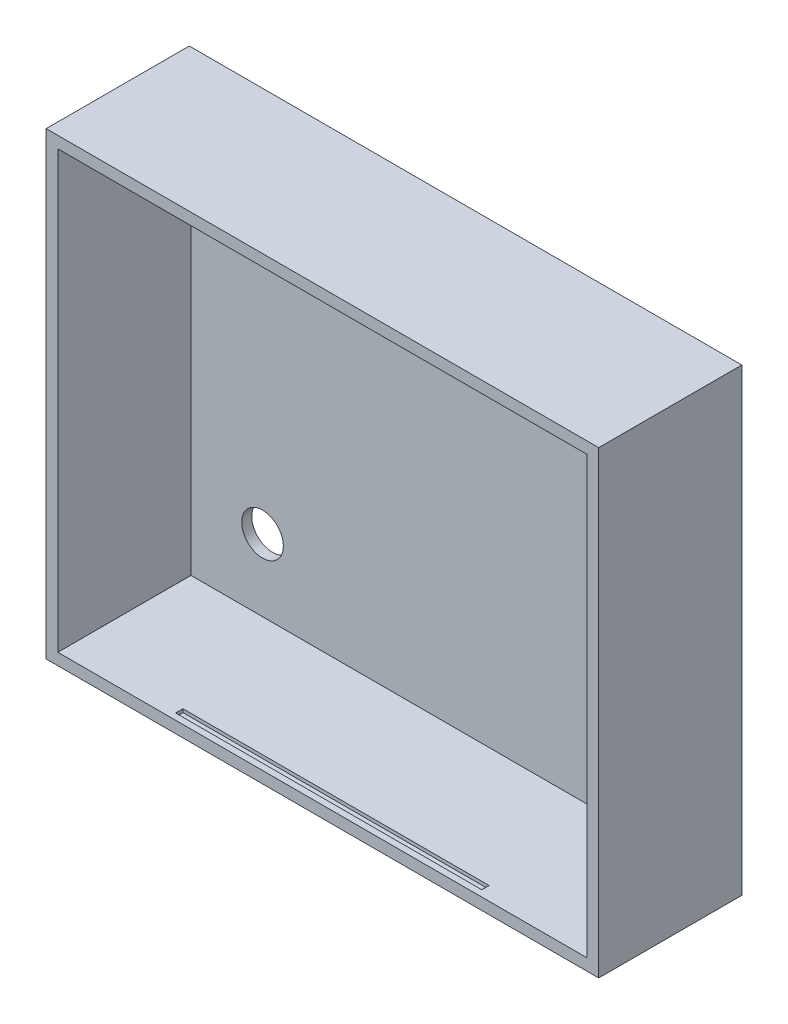
ISO-10303-21;
HEADER;
FILE_DESCRIPTION(('STEP AP214'),'2;1');
FILE_NAME('part.step','',(''),(''),'','','');
FILE_SCHEMA(('AUTOMOTIVE_DESIGN { 1 0 10303 214 1 1 1 1 }'));
ENDSEC;
DATA;
#1=APPLICATION_CONTEXT('core data for automotive mechanical design processes');
#2=APPLICATION_PROTOCOL_DEFINITION('international standard','automotive_design',2000,#1);
#3=PRODUCT_CONTEXT('',#1,'mechanical');
#4=PRODUCT('Part','Part','',(#3));
#5=PRODUCT_RELATED_PRODUCT_CATEGORY('part','',(#4));
#6=PRODUCT_DEFINITION_FORMATION('','',#4);
#7=PRODUCT_DEFINITION_CONTEXT('part definition',#1,'design');
#8=PRODUCT_DEFINITION('design','',#6,#7);
#9=PRODUCT_DEFINITION_SHAPE('','',#8);
#10=(LENGTH_UNIT() NAMED_UNIT(*) SI_UNIT(.MILLI.,.METRE.));
#11=(NAMED_UNIT(*) PLANE_ANGLE_UNIT() SI_UNIT($,.RADIAN.));
#12=(NAMED_UNIT(*) SI_UNIT($,.STERADIAN.) SOLID_ANGLE_UNIT());
#13=UNCERTAINTY_MEASURE_WITH_UNIT(LENGTH_MEASURE(1.E-05),#10,'distance_accuracy_value','');
#14=(GEOMETRIC_REPRESENTATION_CONTEXT(3) GLOBAL_UNCERTAINTY_ASSIGNED_CONTEXT((#13)) GLOBAL_UNIT_ASSIGNED_CONTEXT((#10,
#11,#12)) REPRESENTATION_CONTEXT('',''));
#15=CARTESIAN_POINT('',(0.,0.,0.));
#16=DIRECTION('',(0.,0.,1.));
#17=DIRECTION('',(1.,0.,0.));
#18=AXIS2_PLACEMENT_3D('',#15,#16,#17);
#19=CARTESIAN_POINT('',(83.,-69.,3.));
#20=DIRECTION('',(-1.,0.,0.));
#21=DIRECTION('',(0.,0.,1.));
#22=AXIS2_PLACEMENT_3D('',#19,#20,#21);
#23=PLANE('',#22);
#24=DIRECTION('',(0.,1.,0.));
#25=VECTOR('',#24,1.);
#26=CARTESIAN_POINT('',(83.,-69.,0.));
#27=LINE('',#26,#25);
#28=CARTESIAN_POINT('',(83.,-69.,0.));
#29=VERTEX_POINT('',#28);
#30=CARTESIAN_POINT('',(83.,69.,0.));
#31=VERTEX_POINT('',#30);
#32=EDGE_CURVE('E338',#29,#31,#27,.T.);
#33=ORIENTED_EDGE('',*,*,#32,.T.);
#34=DIRECTION('',(0.,0.,-1.));
#35=VECTOR('',#34,1.);
#36=CARTESIAN_POINT('',(83.,69.,3.));
#37=LINE('',#36,#35);
#38=CARTESIAN_POINT('',(83.,69.,43.));
#39=VERTEX_POINT('',#38);
#40=EDGE_CURVE('E11',#39,#31,#37,.T.);
#41=ORIENTED_EDGE('',*,*,#40,.F.);
#42=DIRECTION('',(0.,1.,0.));
#43=VECTOR('',#42,1.);
#44=CARTESIAN_POINT('',(83.,0.,43.));
#45=LINE('',#44,#43);
#46=CARTESIAN_POINT('',(83.,-69.,43.));
#47=VERTEX_POINT('',#46);
#48=EDGE_CURVE('E298',#47,#39,#45,.T.);
#49=ORIENTED_EDGE('',*,*,#48,.F.);
#50=DIRECTION('',(0.,0.,-1.));
#51=VECTOR('',#50,1.);
#52=CARTESIAN_POINT('',(83.,-69.,3.));
#53=LINE('',#52,#51);
#54=EDGE_CURVE('E351',#47,#29,#53,.T.);
#55=ORIENTED_EDGE('',*,*,#54,.T.);
#56=EDGE_LOOP('',(#33,#41,#49,#55));
#57=FACE_BOUND('',#56,.T.);
#58=ADVANCED_FACE('F41',(#57),#23,.F.);
#59=CARTESIAN_POINT('',(-83.,69.,3.));
#60=DIRECTION('',(0.,-1.,0.));
#61=DIRECTION('',(0.,0.,-1.));
#62=AXIS2_PLACEMENT_3D('',#59,#60,#61);
#63=PLANE('',#62);
#64=DIRECTION('',(-1.,0.,0.));
#65=VECTOR('',#64,1.);
#66=CARTESIAN_POINT('',(-83.,69.,0.));
#67=LINE('',#66,#65);
#68=CARTESIAN_POINT('',(-83.,69.,0.));
#69=VERTEX_POINT('',#68);
#70=EDGE_CURVE('E342',#31,#69,#67,.T.);
#71=ORIENTED_EDGE('',*,*,#70,.T.);
#72=DIRECTION('',(0.,0.,-1.));
#73=VECTOR('',#72,1.);
#74=CARTESIAN_POINT('',(-83.,69.,3.));
#75=LINE('',#74,#73);
#76=CARTESIAN_POINT('',(-83.,69.,43.));
#77=VERTEX_POINT('',#76);
#78=EDGE_CURVE('E49',#77,#69,#75,.T.);
#79=ORIENTED_EDGE('',*,*,#78,.F.);
#80=DIRECTION('',(-1.,0.,0.));
#81=VECTOR('',#80,1.);
#82=CARTESIAN_POINT('',(0.,69.,43.));
#83=LINE('',#82,#81);
#84=EDGE_CURVE('E302',#39,#77,#83,.T.);
#85=ORIENTED_EDGE('',*,*,#84,.F.);
#86=ORIENTED_EDGE('',*,*,#40,.T.);
#87=EDGE_LOOP('',(#71,#79,#85,#86));
#88=FACE_BOUND('',#87,.T.);
#89=ADVANCED_FACE('F377',(#88),#63,.F.);
#90=CARTESIAN_POINT('',(-83.,-69.,3.));
#91=DIRECTION('',(1.,0.,0.));
#92=DIRECTION('',(0.,0.,-1.));
#93=AXIS2_PLACEMENT_3D('',#90,#91,#92);
#94=PLANE('',#93);
#95=DIRECTION('',(0.,-1.,0.));
#96=VECTOR('',#95,1.);
#97=CARTESIAN_POINT('',(-83.,-69.,0.));
#98=LINE('',#97,#96);
#99=CARTESIAN_POINT('',(-83.,-69.,0.));
#100=VERTEX_POINT('',#99);
#101=EDGE_CURVE('E345',#69,#100,#98,.T.);
#102=ORIENTED_EDGE('',*,*,#101,.T.);
#103=DIRECTION('',(0.,0.,-1.));
#104=VECTOR('',#103,1.);
#105=CARTESIAN_POINT('',(-83.,-69.,3.));
#106=LINE('',#105,#104);
#107=CARTESIAN_POINT('',(-83.,-69.,43.));
#108=VERTEX_POINT('',#107);
#109=EDGE_CURVE('E355',#108,#100,#106,.T.);
#110=ORIENTED_EDGE('',*,*,#109,.F.);
#111=DIRECTION('',(0.,-1.,0.));
#112=VECTOR('',#111,1.);
#113=CARTESIAN_POINT('',(-83.,0.,43.));
#114=LINE('',#113,#112);
#115=EDGE_CURVE('E306',#77,#108,#114,.T.);
#116=ORIENTED_EDGE('',*,*,#115,.F.);
#117=ORIENTED_EDGE('',*,*,#78,.T.);
#118=EDGE_LOOP('',(#102,#110,#116,#117));
#119=FACE_BOUND('',#118,.T.);
#120=ADVANCED_FACE('F363',(#119),#94,.F.);
#121=CARTESIAN_POINT('',(-83.,-69.,3.));
#122=DIRECTION('',(0.,1.,0.));
#123=DIRECTION('',(0.,0.,1.));
#124=AXIS2_PLACEMENT_3D('',#121,#122,#123);
#125=PLANE('',#124);
#126=DIRECTION('',(1.,0.,0.));
#127=VECTOR('',#126,1.);
#128=CARTESIAN_POINT('',(-83.,-69.,0.));
#129=LINE('',#128,#127);
#130=EDGE_CURVE('E348',#100,#29,#129,.T.);
#131=ORIENTED_EDGE('',*,*,#130,.T.);
#132=ORIENTED_EDGE('',*,*,#54,.F.);
#133=DIRECTION('',(1.,0.,0.));
#134=VECTOR('',#133,1.);
#135=CARTESIAN_POINT('',(0.,-69.,43.));
#136=LINE('',#135,#134);
#137=EDGE_CURVE('E294',#108,#47,#136,.T.);
#138=ORIENTED_EDGE('',*,*,#137,.F.);
#139=ORIENTED_EDGE('',*,*,#109,.T.);
#140=EDGE_LOOP('',(#131,#132,#138,#139));
#141=FACE_BOUND('',#140,.T.);
#142=ADVANCED_FACE('F371',(#141),#125,.F.);
#143=CARTESIAN_POINT('',(0.,0.,0.));
#144=DIRECTION('',(0.,0.,-1.));
#145=DIRECTION('',(-1.,0.,0.));
#146=AXIS2_PLACEMENT_3D('',#143,#144,#145);
#147=PLANE('',#146);
#148=CARTESIAN_POINT('',(58.,44.,0.));
#149=DIRECTION('',(0.,0.,-1.));
#150=DIRECTION('',(-1.,0.,0.));
#151=AXIS2_PLACEMENT_3D('',#148,#149,#150);
#152=CIRCLE('',#151,6.25);
#153=CARTESIAN_POINT('',(64.25,44.,0.));
#154=VERTEX_POINT('',#153);
#155=EDGE_CURVE('E238',#154,#154,#152,.F.);
#156=ORIENTED_EDGE('',*,*,#155,.T.);
#157=EDGE_LOOP('',(#156));
#158=FACE_BOUND('',#157,.T.);
#159=CARTESIAN_POINT('',(58.,-44.,0.));
#160=DIRECTION('',(0.,0.,-1.));
#161=DIRECTION('',(-1.,0.,0.));
#162=AXIS2_PLACEMENT_3D('',#159,#160,#161);
#163=CIRCLE('',#162,6.25);
#164=CARTESIAN_POINT('',(64.25,-44.,0.));
#165=VERTEX_POINT('',#164);
#166=EDGE_CURVE('E260',#165,#165,#163,.F.);
#167=ORIENTED_EDGE('',*,*,#166,.T.);
#168=EDGE_LOOP('',(#167));
#169=FACE_BOUND('',#168,.T.);
#170=CARTESIAN_POINT('',(-58.,-44.,0.));
#171=DIRECTION('',(0.,0.,-1.));
#172=DIRECTION('',(-1.,0.,0.));
#173=AXIS2_PLACEMENT_3D('',#170,#171,#172);
#174=CIRCLE('',#173,6.25);
#175=CARTESIAN_POINT('',(-51.75,-44.,0.));
#176=VERTEX_POINT('',#175);
#177=EDGE_CURVE('E252',#176,#176,#174,.F.);
#178=ORIENTED_EDGE('',*,*,#177,.T.);
#179=EDGE_LOOP('',(#178));
#180=FACE_BOUND('',#179,.T.);
#181=CARTESIAN_POINT('',(-58.,44.,0.));
#182=DIRECTION('',(0.,0.,-1.));
#183=DIRECTION('',(-1.,0.,0.));
#184=AXIS2_PLACEMENT_3D('',#181,#182,#183);
#185=CIRCLE('',#184,6.25);
#186=CARTESIAN_POINT('',(-51.75,44.,0.));
#187=VERTEX_POINT('',#186);
#188=EDGE_CURVE('E251',#187,#187,#185,.F.);
#189=ORIENTED_EDGE('',*,*,#188,.T.);
#190=EDGE_LOOP('',(#189));
#191=FACE_BOUND('',#190,.T.);
#192=ORIENTED_EDGE('',*,*,#32,.F.);
#193=ORIENTED_EDGE('',*,*,#130,.F.);
#194=ORIENTED_EDGE('',*,*,#101,.F.);
#195=ORIENTED_EDGE('',*,*,#70,.F.);
#196=EDGE_LOOP('',(#192,#193,#194,#195));
#197=FACE_BOUND('',#196,.T.);
#198=ADVANCED_FACE('F369',(#158,#169,#180,#191,#197),#147,.T.);
#199=CARTESIAN_POINT('',(79.5,0.,43.));
#200=DIRECTION('',(-1.,0.,0.));
#201=DIRECTION('',(0.,0.,1.));
#202=AXIS2_PLACEMENT_3D('',#199,#200,#201);
#203=PLANE('',#202);
#204=DIRECTION('',(0.,1.,0.));
#205=VECTOR('',#204,1.);
#206=CARTESIAN_POINT('',(79.5,0.,3.));
#207=LINE('',#206,#205);
#208=CARTESIAN_POINT('',(79.5,-65.5,3.));
#209=VERTEX_POINT('',#208);
#210=CARTESIAN_POINT('',(79.5,65.5,3.));
#211=VERTEX_POINT('',#210);
#212=EDGE_CURVE('E275',#209,#211,#207,.T.);
#213=ORIENTED_EDGE('',*,*,#212,.F.);
#214=DIRECTION('',(0.,0.,-1.));
#215=VECTOR('',#214,1.);
#216=CARTESIAN_POINT('',(79.5,-65.5,43.));
#217=LINE('',#216,#215);
#218=CARTESIAN_POINT('',(79.5,-65.5,43.));
#219=VERTEX_POINT('',#218);
#220=EDGE_CURVE('E334',#219,#209,#217,.T.);
#221=ORIENTED_EDGE('',*,*,#220,.F.);
#222=DIRECTION('',(0.,1.,0.));
#223=VECTOR('',#222,1.);
#224=CARTESIAN_POINT('',(79.5,0.,43.));
#225=LINE('',#224,#223);
#226=CARTESIAN_POINT('',(79.5,65.5,43.));
#227=VERTEX_POINT('',#226);
#228=EDGE_CURVE('E279',#219,#227,#225,.T.);
#229=ORIENTED_EDGE('',*,*,#228,.T.);
#230=DIRECTION('',(0.,0.,-1.));
#231=VECTOR('',#230,1.);
#232=CARTESIAN_POINT('',(79.5,65.5,43.));
#233=LINE('',#232,#231);
#234=EDGE_CURVE('E310',#227,#211,#233,.T.);
#235=ORIENTED_EDGE('',*,*,#234,.T.);
#236=EDGE_LOOP('',(#213,#221,#229,#235));
#237=FACE_BOUND('',#236,.T.);
#238=ADVANCED_FACE('F389',(#237),#203,.T.);
#239=CARTESIAN_POINT('',(0.,-65.5,43.));
#240=DIRECTION('',(0.,1.,0.));
#241=DIRECTION('',(0.,0.,1.));
#242=AXIS2_PLACEMENT_3D('',#239,#240,#241);
#243=PLANE('',#242);
#244=DIRECTION('',(0.,0.,-1.));
#245=VECTOR('',#244,1.);
#246=CARTESIAN_POINT('',(45.98504456449,-65.5,38.9));
#247=LINE('',#246,#245);
#248=CARTESIAN_POINT('',(45.98504456449,-65.5,41.1));
#249=VERTEX_POINT('',#248);
#250=CARTESIAN_POINT('',(45.98504456449,-65.5,38.9));
#251=VERTEX_POINT('',#250);
#252=EDGE_CURVE('E56',#249,#251,#247,.T.);
#253=ORIENTED_EDGE('',*,*,#252,.F.);
#254=DIRECTION('',(1.,0.,0.));
#255=VECTOR('',#254,1.);
#256=CARTESIAN_POINT('',(-46.01495543551,-65.5,41.1));
#257=LINE('',#256,#255);
#258=CARTESIAN_POINT('',(-46.01495543551,-65.5,41.1));
#259=VERTEX_POINT('',#258);
#260=EDGE_CURVE('E177',#259,#249,#257,.T.);
#261=ORIENTED_EDGE('',*,*,#260,.F.);
#262=DIRECTION('',(0.,0.,1.));
#263=VECTOR('',#262,1.);
#264=CARTESIAN_POINT('',(-46.01495543551,-65.5,38.9));
#265=LINE('',#264,#263);
#266=CARTESIAN_POINT('',(-46.01495543551,-65.5,38.9));
#267=VERTEX_POINT('',#266);
#268=EDGE_CURVE('E181',#267,#259,#265,.T.);
#269=ORIENTED_EDGE('',*,*,#268,.F.);
#270=DIRECTION('',(-1.,0.,0.));
#271=VECTOR('',#270,1.);
#272=CARTESIAN_POINT('',(-46.01495543551,-65.5,38.9));
#273=LINE('',#272,#271);
#274=EDGE_CURVE('E190',#251,#267,#273,.T.);
#275=ORIENTED_EDGE('',*,*,#274,.F.);
#276=EDGE_LOOP('',(#253,#261,#269,#275));
#277=FACE_BOUND('',#276,.T.);
#278=DIRECTION('',(1.,0.,0.));
#279=VECTOR('',#278,1.);
#280=CARTESIAN_POINT('',(0.,-65.5,3.));
#281=LINE('',#280,#279);
#282=CARTESIAN_POINT('',(-79.5,-65.5,3.));
#283=VERTEX_POINT('',#282);
#284=EDGE_CURVE('E313',#283,#209,#281,.T.);
#285=ORIENTED_EDGE('',*,*,#284,.F.);
#286=DIRECTION('',(0.,0.,-1.));
#287=VECTOR('',#286,1.);
#288=CARTESIAN_POINT('',(-79.5,-65.5,43.));
#289=LINE('',#288,#287);
#290=CARTESIAN_POINT('',(-79.5,-65.5,43.));
#291=VERTEX_POINT('',#290);
#292=EDGE_CURVE('E330',#291,#283,#289,.T.);
#293=ORIENTED_EDGE('',*,*,#292,.F.);
#294=DIRECTION('',(1.,0.,0.));
#295=VECTOR('',#294,1.);
#296=CARTESIAN_POINT('',(0.,-65.5,43.));
#297=LINE('',#296,#295);
#298=EDGE_CURVE('E283',#291,#219,#297,.T.);
#299=ORIENTED_EDGE('',*,*,#298,.T.);
#300=ORIENTED_EDGE('',*,*,#220,.T.);
#301=EDGE_LOOP('',(#285,#293,#299,#300));
#302=FACE_BOUND('',#301,.T.);
#303=ADVANCED_FACE('F398',(#277,#302),#243,.T.);
#304=CARTESIAN_POINT('',(-79.5,0.,43.));
#305=DIRECTION('',(-1.,0.,0.));
#306=DIRECTION('',(0.,0.,1.));
#307=AXIS2_PLACEMENT_3D('',#304,#305,#306);
#308=PLANE('',#307);
#309=DIRECTION('',(0.,1.,0.));
#310=VECTOR('',#309,1.);
#311=CARTESIAN_POINT('',(-79.5,0.,3.));
#312=LINE('',#311,#310);
#313=CARTESIAN_POINT('',(-79.5,65.5,3.));
#314=VERTEX_POINT('',#313);
#315=EDGE_CURVE('E316',#283,#314,#312,.T.);
#316=ORIENTED_EDGE('',*,*,#315,.T.);
#317=DIRECTION('',(0.,0.,-1.));
#318=VECTOR('',#317,1.);
#319=CARTESIAN_POINT('',(-79.5,65.5,43.));
#320=LINE('',#319,#318);
#321=CARTESIAN_POINT('',(-79.5,65.5,43.));
#322=VERTEX_POINT('',#321);
#323=EDGE_CURVE('E326',#322,#314,#320,.T.);
#324=ORIENTED_EDGE('',*,*,#323,.F.);
#325=DIRECTION('',(0.,1.,0.));
#326=VECTOR('',#325,1.);
#327=CARTESIAN_POINT('',(-79.5,0.,43.));
#328=LINE('',#327,#326);
#329=EDGE_CURVE('E288',#291,#322,#328,.T.);
#330=ORIENTED_EDGE('',*,*,#329,.F.);
#331=ORIENTED_EDGE('',*,*,#292,.T.);
#332=EDGE_LOOP('',(#316,#324,#330,#331));
#333=FACE_BOUND('',#332,.T.);
#334=ADVANCED_FACE('F402',(#333),#308,.F.);
#335=CARTESIAN_POINT('',(0.,65.5,43.));
#336=DIRECTION('',(0.,1.,0.));
#337=DIRECTION('',(0.,0.,1.));
#338=AXIS2_PLACEMENT_3D('',#335,#336,#337);
#339=PLANE('',#338);
#340=DIRECTION('',(-1.,0.,0.));
#341=VECTOR('',#340,1.);
#342=CARTESIAN_POINT('',(-46.,65.5,41.1));
#343=LINE('',#342,#341);
#344=CARTESIAN_POINT('',(46.,65.5,41.1));
#345=VERTEX_POINT('',#344);
#346=CARTESIAN_POINT('',(-46.,65.5,41.1));
#347=VERTEX_POINT('',#346);
#348=EDGE_CURVE('E224',#345,#347,#343,.T.);
#349=ORIENTED_EDGE('',*,*,#348,.F.);
#350=DIRECTION('',(0.,0.,1.));
#351=VECTOR('',#350,1.);
#352=CARTESIAN_POINT('',(46.,65.5,41.1));
#353=LINE('',#352,#351);
#354=CARTESIAN_POINT('',(46.,65.5,38.9));
#355=VERTEX_POINT('',#354);
#356=EDGE_CURVE('E64',#355,#345,#353,.T.);
#357=ORIENTED_EDGE('',*,*,#356,.F.);
#358=DIRECTION('',(1.,0.,0.));
#359=VECTOR('',#358,1.);
#360=CARTESIAN_POINT('',(-46.,65.5,38.9));
#361=LINE('',#360,#359);
#362=CARTESIAN_POINT('',(-46.,65.5,38.9));
#363=VERTEX_POINT('',#362);
#364=EDGE_CURVE('E209',#363,#355,#361,.T.);
#365=ORIENTED_EDGE('',*,*,#364,.F.);
#366=DIRECTION('',(0.,0.,-1.));
#367=VECTOR('',#366,1.);
#368=CARTESIAN_POINT('',(-46.,65.5,41.1));
#369=LINE('',#368,#367);
#370=EDGE_CURVE('E228',#347,#363,#369,.T.);
#371=ORIENTED_EDGE('',*,*,#370,.F.);
#372=EDGE_LOOP('',(#349,#357,#365,#371));
#373=FACE_BOUND('',#372,.T.);
#374=DIRECTION('',(1.,0.,0.));
#375=VECTOR('',#374,1.);
#376=CARTESIAN_POINT('',(0.,65.5,3.));
#377=LINE('',#376,#375);
#378=EDGE_CURVE('E284',#314,#211,#377,.T.);
#379=ORIENTED_EDGE('',*,*,#378,.T.);
#380=ORIENTED_EDGE('',*,*,#234,.F.);
#381=DIRECTION('',(1.,0.,0.));
#382=VECTOR('',#381,1.);
#383=CARTESIAN_POINT('',(0.,65.5,43.));
#384=LINE('',#383,#382);
#385=EDGE_CURVE('E291',#322,#227,#384,.T.);
#386=ORIENTED_EDGE('',*,*,#385,.F.);
#387=ORIENTED_EDGE('',*,*,#323,.T.);
#388=EDGE_LOOP('',(#379,#380,#386,#387));
#389=FACE_BOUND('',#388,.T.);
#390=ADVANCED_FACE('F406',(#373,#389),#339,.F.);
#391=CARTESIAN_POINT('',(0.,0.,43.));
#392=DIRECTION('',(0.,0.,1.));
#393=DIRECTION('',(1.,0.,0.));
#394=AXIS2_PLACEMENT_3D('',#391,#392,#393);
#395=PLANE('',#394);
#396=ORIENTED_EDGE('',*,*,#228,.F.);
#397=ORIENTED_EDGE('',*,*,#298,.F.);
#398=ORIENTED_EDGE('',*,*,#329,.T.);
#399=ORIENTED_EDGE('',*,*,#385,.T.);
#400=EDGE_LOOP('',(#396,#397,#398,#399));
#401=FACE_BOUND('',#400,.T.);
#402=ORIENTED_EDGE('',*,*,#137,.T.);
#403=ORIENTED_EDGE('',*,*,#48,.T.);
#404=ORIENTED_EDGE('',*,*,#84,.T.);
#405=ORIENTED_EDGE('',*,*,#115,.T.);
#406=EDGE_LOOP('',(#402,#403,#404,#405));
#407=FACE_BOUND('',#406,.T.);
#408=ADVANCED_FACE('F376',(#401,#407),#395,.T.);
#409=CARTESIAN_POINT('',(0.,0.,3.));
#410=DIRECTION('',(0.,0.,-1.));
#411=DIRECTION('',(-1.,0.,0.));
#412=AXIS2_PLACEMENT_3D('',#409,#410,#411);
#413=PLANE('',#412);
#414=CARTESIAN_POINT('',(58.,44.,3.));
#415=DIRECTION('',(0.,0.,1.));
#416=DIRECTION('',(-1.,0.,0.));
#417=AXIS2_PLACEMENT_3D('',#414,#415,#416);
#418=CIRCLE('',#417,6.25);
#419=CARTESIAN_POINT('',(64.25,44.,3.));
#420=VERTEX_POINT('',#419);
#421=EDGE_CURVE('E264',#420,#420,#418,.T.);
#422=ORIENTED_EDGE('',*,*,#421,.F.);
#423=EDGE_LOOP('',(#422));
#424=FACE_BOUND('',#423,.T.);
#425=CARTESIAN_POINT('',(58.,-44.,3.));
#426=DIRECTION('',(0.,0.,1.));
#427=DIRECTION('',(1.,0.,0.));
#428=AXIS2_PLACEMENT_3D('',#425,#426,#427);
#429=CIRCLE('',#428,6.25);
#430=CARTESIAN_POINT('',(64.25,-44.,3.));
#431=VERTEX_POINT('',#430);
#432=EDGE_CURVE('E256',#431,#431,#429,.T.);
#433=ORIENTED_EDGE('',*,*,#432,.F.);
#434=EDGE_LOOP('',(#433));
#435=FACE_BOUND('',#434,.T.);
#436=CARTESIAN_POINT('',(-58.,-44.,3.));
#437=DIRECTION('',(0.,0.,1.));
#438=DIRECTION('',(-1.,0.,0.));
#439=AXIS2_PLACEMENT_3D('',#436,#437,#438);
#440=CIRCLE('',#439,6.25);
#441=CARTESIAN_POINT('',(-51.75,-44.,3.));
#442=VERTEX_POINT('',#441);
#443=EDGE_CURVE('E247',#442,#442,#440,.T.);
#444=ORIENTED_EDGE('',*,*,#443,.F.);
#445=EDGE_LOOP('',(#444));
#446=FACE_BOUND('',#445,.T.);
#447=CARTESIAN_POINT('',(-58.,44.,3.));
#448=DIRECTION('',(0.,0.,1.));
#449=DIRECTION('',(1.,0.,0.));
#450=AXIS2_PLACEMENT_3D('',#447,#448,#449);
#451=CIRCLE('',#450,6.25);
#452=CARTESIAN_POINT('',(-51.75,44.,3.));
#453=VERTEX_POINT('',#452);
#454=EDGE_CURVE('E271',#453,#453,#451,.T.);
#455=ORIENTED_EDGE('',*,*,#454,.F.);
#456=EDGE_LOOP('',(#455));
#457=FACE_BOUND('',#456,.T.);
#458=ORIENTED_EDGE('',*,*,#284,.T.);
#459=ORIENTED_EDGE('',*,*,#212,.T.);
#460=ORIENTED_EDGE('',*,*,#378,.F.);
#461=ORIENTED_EDGE('',*,*,#315,.F.);
#462=EDGE_LOOP('',(#458,#459,#460,#461));
#463=FACE_BOUND('',#462,.T.);
#464=ADVANCED_FACE('F391',(#424,#435,#446,#457,#463),#413,.F.);
#465=CARTESIAN_POINT('',(-58.,44.,-0.00100000000000013));
#466=DIRECTION('',(0.,0.,1.));
#467=DIRECTION('',(1.,0.,0.));
#468=AXIS2_PLACEMENT_3D('',#465,#466,#467);
#469=CYLINDRICAL_SURFACE('',#468,6.25);
#470=CARTESIAN_POINT('',(-51.75,44.,0.));
#471=CARTESIAN_POINT('',(-51.75,44.,0.03125));
#472=CARTESIAN_POINT('',(-51.75,44.,0.0625));
#473=CARTESIAN_POINT('',(-51.75,44.,0.125));
#474=CARTESIAN_POINT('',(-51.75,44.,0.15625));
#475=CARTESIAN_POINT('',(-51.75,44.,0.21875));
#476=CARTESIAN_POINT('',(-51.75,44.,0.25));
#477=CARTESIAN_POINT('',(-51.75,44.,0.3125));
#478=CARTESIAN_POINT('',(-51.75,44.,0.34375));
#479=CARTESIAN_POINT('',(-51.75,44.,0.40625));
#480=CARTESIAN_POINT('',(-51.75,44.,0.4375));
#481=CARTESIAN_POINT('',(-51.75,44.,0.5));
#482=CARTESIAN_POINT('',(-51.75,44.,0.53125));
#483=CARTESIAN_POINT('',(-51.75,44.,0.59375));
#484=CARTESIAN_POINT('',(-51.75,44.,0.625));
#485=CARTESIAN_POINT('',(-51.75,44.,0.6875));
#486=CARTESIAN_POINT('',(-51.75,44.,0.71875));
#487=CARTESIAN_POINT('',(-51.75,44.,0.78125));
#488=CARTESIAN_POINT('',(-51.75,44.,0.8125));
#489=CARTESIAN_POINT('',(-51.75,44.,0.875));
#490=CARTESIAN_POINT('',(-51.75,44.,0.90625));
#491=CARTESIAN_POINT('',(-51.75,44.,0.96875));
#492=CARTESIAN_POINT('',(-51.75,44.,1.));
#493=CARTESIAN_POINT('',(-51.75,44.,1.0625));
#494=CARTESIAN_POINT('',(-51.75,44.,1.09375));
#495=CARTESIAN_POINT('',(-51.75,44.,1.15625));
#496=CARTESIAN_POINT('',(-51.75,44.,1.1875));
#497=CARTESIAN_POINT('',(-51.75,44.,1.25));
#498=CARTESIAN_POINT('',(-51.75,44.,1.28125));
#499=CARTESIAN_POINT('',(-51.75,44.,1.34375));
#500=CARTESIAN_POINT('',(-51.75,44.,1.375));
#501=CARTESIAN_POINT('',(-51.75,44.,1.4375));
#502=CARTESIAN_POINT('',(-51.75,44.,1.46875));
#503=CARTESIAN_POINT('',(-51.75,44.,1.53125));
#504=CARTESIAN_POINT('',(-51.75,44.,1.5625));
#505=CARTESIAN_POINT('',(-51.75,44.,1.625));
#506=CARTESIAN_POINT('',(-51.75,44.,1.65625));
#507=CARTESIAN_POINT('',(-51.75,44.,1.71875));
#508=CARTESIAN_POINT('',(-51.75,44.,1.75));
#509=CARTESIAN_POINT('',(-51.75,44.,1.8125));
#510=CARTESIAN_POINT('',(-51.75,44.,1.84375));
#511=CARTESIAN_POINT('',(-51.75,44.,1.90625));
#512=CARTESIAN_POINT('',(-51.75,44.,1.9375));
#513=CARTESIAN_POINT('',(-51.75,44.,2.));
#514=CARTESIAN_POINT('',(-51.75,44.,2.03125));
#515=CARTESIAN_POINT('',(-51.75,44.,2.09375));
#516=CARTESIAN_POINT('',(-51.75,44.,2.125));
#517=CARTESIAN_POINT('',(-51.75,44.,2.1875));
#518=CARTESIAN_POINT('',(-51.75,44.,2.21875));
#519=CARTESIAN_POINT('',(-51.75,44.,2.28125));
#520=CARTESIAN_POINT('',(-51.75,44.,2.3125));
#521=CARTESIAN_POINT('',(-51.75,44.,2.375));
#522=CARTESIAN_POINT('',(-51.75,44.,2.40625));
#523=CARTESIAN_POINT('',(-51.75,44.,2.46875));
#524=CARTESIAN_POINT('',(-51.75,44.,2.5));
#525=CARTESIAN_POINT('',(-51.75,44.,2.5625));
#526=CARTESIAN_POINT('',(-51.75,44.,2.59375));
#527=CARTESIAN_POINT('',(-51.75,44.,2.65625));
#528=CARTESIAN_POINT('',(-51.75,44.,2.6875));
#529=CARTESIAN_POINT('',(-51.75,44.,2.75));
#530=CARTESIAN_POINT('',(-51.75,44.,2.78125));
#531=CARTESIAN_POINT('',(-51.75,44.,2.84375));
#532=CARTESIAN_POINT('',(-51.75,44.,2.875));
#533=CARTESIAN_POINT('',(-51.75,44.,2.9375));
#534=CARTESIAN_POINT('',(-51.75,44.,2.96875));
#535=CARTESIAN_POINT('',(-51.75,44.,3.));
#536=B_SPLINE_CURVE_WITH_KNOTS('',3,(#470,#471,#472,#473,#474,#475,#476,#477,#478,#479,#480,
#481,#482,#483,#484,#485,#486,#487,#488,#489,#490,#491,#492,#493,#494,#495,#496,#497,#498,#499,
#500,#501,#502,#503,#504,#505,#506,#507,#508,#509,#510,#511,#512,#513,#514,#515,#516,#517,#518,
#519,#520,#521,#522,#523,#524,#525,#526,#527,#528,#529,#530,#531,#532,#533,#534,#535),
.UNSPECIFIED.,.F.,.F.,(4,2,2,2,2,2,2,2,2,2,2,2,2,2,2,2,2,2,2,2,2,2,2,2,2,2,2,2,2,2,2,2,4),(0.,
0.09375,0.1875,0.28125,0.375,0.46875,0.5625,0.65625,0.75,0.84375,0.9375,1.03125,1.125,1.21875,
1.3125,1.40625,1.5,1.59375,1.6875,1.78125,1.875,1.96875,2.0625,2.15625,2.25,2.34375,2.4375,
2.53125,2.625,2.71875,2.8125,2.90625,3.),.UNSPECIFIED.);
#537=EDGE_CURVE('BSEAM394',#187,#453,#536,.T.);
#538=ORIENTED_EDGE('',*,*,#188,.F.);
#539=ORIENTED_EDGE('',*,*,#454,.T.);
#540=ORIENTED_EDGE('',*,*,#537,.T.);
#541=ORIENTED_EDGE('',*,*,#537,.F.);
#542=EDGE_LOOP('',(#538,#540,#539,#541));
#543=FACE_BOUND('',#542,.T.);
#544=ADVANCED_FACE('F394',(#543),#469,.F.);
#545=CARTESIAN_POINT('',(-58.,-44.,-0.00100000000000013));
#546=DIRECTION('',(0.,0.,1.));
#547=DIRECTION('',(1.,0.,0.));
#548=AXIS2_PLACEMENT_3D('',#545,#546,#547);
#549=CYLINDRICAL_SURFACE('',#548,6.25);
#550=CARTESIAN_POINT('',(-51.75,-44.,0.));
#551=CARTESIAN_POINT('',(-51.75,-44.,0.03125));
#552=CARTESIAN_POINT('',(-51.75,-44.,0.0625));
#553=CARTESIAN_POINT('',(-51.75,-44.,0.125));
#554=CARTESIAN_POINT('',(-51.75,-44.,0.15625));
#555=CARTESIAN_POINT('',(-51.75,-44.,0.21875));
#556=CARTESIAN_POINT('',(-51.75,-44.,0.25));
#557=CARTESIAN_POINT('',(-51.75,-44.,0.3125));
#558=CARTESIAN_POINT('',(-51.75,-44.,0.34375));
#559=CARTESIAN_POINT('',(-51.75,-44.,0.40625));
#560=CARTESIAN_POINT('',(-51.75,-44.,0.4375));
#561=CARTESIAN_POINT('',(-51.75,-44.,0.5));
#562=CARTESIAN_POINT('',(-51.75,-44.,0.53125));
#563=CARTESIAN_POINT('',(-51.75,-44.,0.59375));
#564=CARTESIAN_POINT('',(-51.75,-44.,0.625));
#565=CARTESIAN_POINT('',(-51.75,-44.,0.6875));
#566=CARTESIAN_POINT('',(-51.75,-44.,0.71875));
#567=CARTESIAN_POINT('',(-51.75,-44.,0.78125));
#568=CARTESIAN_POINT('',(-51.75,-44.,0.8125));
#569=CARTESIAN_POINT('',(-51.75,-44.,0.875));
#570=CARTESIAN_POINT('',(-51.75,-44.,0.90625));
#571=CARTESIAN_POINT('',(-51.75,-44.,0.96875));
#572=CARTESIAN_POINT('',(-51.75,-44.,1.));
#573=CARTESIAN_POINT('',(-51.75,-44.,1.0625));
#574=CARTESIAN_POINT('',(-51.75,-44.,1.09375));
#575=CARTESIAN_POINT('',(-51.75,-44.,1.15625));
#576=CARTESIAN_POINT('',(-51.75,-44.,1.1875));
#577=CARTESIAN_POINT('',(-51.75,-44.,1.25));
#578=CARTESIAN_POINT('',(-51.75,-44.,1.28125));
#579=CARTESIAN_POINT('',(-51.75,-44.,1.34375));
#580=CARTESIAN_POINT('',(-51.75,-44.,1.375));
#581=CARTESIAN_POINT('',(-51.75,-44.,1.4375));
#582=CARTESIAN_POINT('',(-51.75,-44.,1.46875));
#583=CARTESIAN_POINT('',(-51.75,-44.,1.53125));
#584=CARTESIAN_POINT('',(-51.75,-44.,1.5625));
#585=CARTESIAN_POINT('',(-51.75,-44.,1.625));
#586=CARTESIAN_POINT('',(-51.75,-44.,1.65625));
#587=CARTESIAN_POINT('',(-51.75,-44.,1.71875));
#588=CARTESIAN_POINT('',(-51.75,-44.,1.75));
#589=CARTESIAN_POINT('',(-51.75,-44.,1.8125));
#590=CARTESIAN_POINT('',(-51.75,-44.,1.84375));
#591=CARTESIAN_POINT('',(-51.75,-44.,1.90625));
#592=CARTESIAN_POINT('',(-51.75,-44.,1.9375));
#593=CARTESIAN_POINT('',(-51.75,-44.,2.));
#594=CARTESIAN_POINT('',(-51.75,-44.,2.03125));
#595=CARTESIAN_POINT('',(-51.75,-44.,2.09375));
#596=CARTESIAN_POINT('',(-51.75,-44.,2.125));
#597=CARTESIAN_POINT('',(-51.75,-44.,2.1875));
#598=CARTESIAN_POINT('',(-51.75,-44.,2.21875));
#599=CARTESIAN_POINT('',(-51.75,-44.,2.28125));
#600=CARTESIAN_POINT('',(-51.75,-44.,2.3125));
#601=CARTESIAN_POINT('',(-51.75,-44.,2.375));
#602=CARTESIAN_POINT('',(-51.75,-44.,2.40625));
#603=CARTESIAN_POINT('',(-51.75,-44.,2.46875));
#604=CARTESIAN_POINT('',(-51.75,-44.,2.5));
#605=CARTESIAN_POINT('',(-51.75,-44.,2.5625));
#606=CARTESIAN_POINT('',(-51.75,-44.,2.59375));
#607=CARTESIAN_POINT('',(-51.75,-44.,2.65625));
#608=CARTESIAN_POINT('',(-51.75,-44.,2.6875));
#609=CARTESIAN_POINT('',(-51.75,-44.,2.75));
#610=CARTESIAN_POINT('',(-51.75,-44.,2.78125));
#611=CARTESIAN_POINT('',(-51.75,-44.,2.84375));
#612=CARTESIAN_POINT('',(-51.75,-44.,2.875));
#613=CARTESIAN_POINT('',(-51.75,-44.,2.9375));
#614=CARTESIAN_POINT('',(-51.75,-44.,2.96875));
#615=CARTESIAN_POINT('',(-51.75,-44.,3.));
#616=B_SPLINE_CURVE_WITH_KNOTS('',3,(#550,#551,#552,#553,#554,#555,#556,#557,#558,#559,#560,
#561,#562,#563,#564,#565,#566,#567,#568,#569,#570,#571,#572,#573,#574,#575,#576,#577,#578,#579,
#580,#581,#582,#583,#584,#585,#586,#587,#588,#589,#590,#591,#592,#593,#594,#595,#596,#597,#598,
#599,#600,#601,#602,#603,#604,#605,#606,#607,#608,#609,#610,#611,#612,#613,#614,#615),
.UNSPECIFIED.,.F.,.F.,(4,2,2,2,2,2,2,2,2,2,2,2,2,2,2,2,2,2,2,2,2,2,2,2,2,2,2,2,2,2,2,2,4),(0.,
0.09375,0.1875,0.28125,0.375,0.46875,0.5625,0.65625,0.75,0.84375,0.9375,1.03125,1.125,1.21875,
1.3125,1.40625,1.5,1.59375,1.6875,1.78125,1.875,1.96875,2.0625,2.15625,2.25,2.34375,2.4375,
2.53125,2.625,2.71875,2.8125,2.90625,3.),.UNSPECIFIED.);
#617=EDGE_CURVE('BSEAM416',#176,#442,#616,.T.);
#618=ORIENTED_EDGE('',*,*,#177,.F.);
#619=ORIENTED_EDGE('',*,*,#443,.T.);
#620=ORIENTED_EDGE('',*,*,#617,.T.);
#621=ORIENTED_EDGE('',*,*,#617,.F.);
#622=EDGE_LOOP('',(#618,#620,#619,#621));
#623=FACE_BOUND('',#622,.T.);
#624=ADVANCED_FACE('F416',(#623),#549,.F.);
#625=CARTESIAN_POINT('',(58.,-44.,-0.00100000000000013));
#626=DIRECTION('',(0.,0.,1.));
#627=DIRECTION('',(1.,0.,0.));
#628=AXIS2_PLACEMENT_3D('',#625,#626,#627);
#629=CYLINDRICAL_SURFACE('',#628,6.25);
#630=CARTESIAN_POINT('',(64.25,-44.,0.));
#631=CARTESIAN_POINT('',(64.25,-44.,0.03125));
#632=CARTESIAN_POINT('',(64.25,-44.,0.0625));
#633=CARTESIAN_POINT('',(64.25,-44.,0.125));
#634=CARTESIAN_POINT('',(64.25,-44.,0.15625));
#635=CARTESIAN_POINT('',(64.25,-44.,0.21875));
#636=CARTESIAN_POINT('',(64.25,-44.,0.25));
#637=CARTESIAN_POINT('',(64.25,-44.,0.3125));
#638=CARTESIAN_POINT('',(64.25,-44.,0.34375));
#639=CARTESIAN_POINT('',(64.25,-44.,0.40625));
#640=CARTESIAN_POINT('',(64.25,-44.,0.4375));
#641=CARTESIAN_POINT('',(64.25,-44.,0.5));
#642=CARTESIAN_POINT('',(64.25,-44.,0.53125));
#643=CARTESIAN_POINT('',(64.25,-44.,0.59375));
#644=CARTESIAN_POINT('',(64.25,-44.,0.625));
#645=CARTESIAN_POINT('',(64.25,-44.,0.6875));
#646=CARTESIAN_POINT('',(64.25,-44.,0.71875));
#647=CARTESIAN_POINT('',(64.25,-44.,0.78125));
#648=CARTESIAN_POINT('',(64.25,-44.,0.8125));
#649=CARTESIAN_POINT('',(64.25,-44.,0.875));
#650=CARTESIAN_POINT('',(64.25,-44.,0.90625));
#651=CARTESIAN_POINT('',(64.25,-44.,0.96875));
#652=CARTESIAN_POINT('',(64.25,-44.,1.));
#653=CARTESIAN_POINT('',(64.25,-44.,1.0625));
#654=CARTESIAN_POINT('',(64.25,-44.,1.09375));
#655=CARTESIAN_POINT('',(64.25,-44.,1.15625));
#656=CARTESIAN_POINT('',(64.25,-44.,1.1875));
#657=CARTESIAN_POINT('',(64.25,-44.,1.25));
#658=CARTESIAN_POINT('',(64.25,-44.,1.28125));
#659=CARTESIAN_POINT('',(64.25,-44.,1.34375));
#660=CARTESIAN_POINT('',(64.25,-44.,1.375));
#661=CARTESIAN_POINT('',(64.25,-44.,1.4375));
#662=CARTESIAN_POINT('',(64.25,-44.,1.46875));
#663=CARTESIAN_POINT('',(64.25,-44.,1.53125));
#664=CARTESIAN_POINT('',(64.25,-44.,1.5625));
#665=CARTESIAN_POINT('',(64.25,-44.,1.625));
#666=CARTESIAN_POINT('',(64.25,-44.,1.65625));
#667=CARTESIAN_POINT('',(64.25,-44.,1.71875));
#668=CARTESIAN_POINT('',(64.25,-44.,1.75));
#669=CARTESIAN_POINT('',(64.25,-44.,1.8125));
#670=CARTESIAN_POINT('',(64.25,-44.,1.84375));
#671=CARTESIAN_POINT('',(64.25,-44.,1.90625));
#672=CARTESIAN_POINT('',(64.25,-44.,1.9375));
#673=CARTESIAN_POINT('',(64.25,-44.,2.));
#674=CARTESIAN_POINT('',(64.25,-44.,2.03125));
#675=CARTESIAN_POINT('',(64.25,-44.,2.09375));
#676=CARTESIAN_POINT('',(64.25,-44.,2.125));
#677=CARTESIAN_POINT('',(64.25,-44.,2.1875));
#678=CARTESIAN_POINT('',(64.25,-44.,2.21875));
#679=CARTESIAN_POINT('',(64.25,-44.,2.28125));
#680=CARTESIAN_POINT('',(64.25,-44.,2.3125));
#681=CARTESIAN_POINT('',(64.25,-44.,2.375));
#682=CARTESIAN_POINT('',(64.25,-44.,2.40625));
#683=CARTESIAN_POINT('',(64.25,-44.,2.46875));
#684=CARTESIAN_POINT('',(64.25,-44.,2.5));
#685=CARTESIAN_POINT('',(64.25,-44.,2.5625));
#686=CARTESIAN_POINT('',(64.25,-44.,2.59375));
#687=CARTESIAN_POINT('',(64.25,-44.,2.65625));
#688=CARTESIAN_POINT('',(64.25,-44.,2.6875));
#689=CARTESIAN_POINT('',(64.25,-44.,2.75));
#690=CARTESIAN_POINT('',(64.25,-44.,2.78125));
#691=CARTESIAN_POINT('',(64.25,-44.,2.84375));
#692=CARTESIAN_POINT('',(64.25,-44.,2.875));
#693=CARTESIAN_POINT('',(64.25,-44.,2.9375));
#694=CARTESIAN_POINT('',(64.25,-44.,2.96875));
#695=CARTESIAN_POINT('',(64.25,-44.,3.));
#696=B_SPLINE_CURVE_WITH_KNOTS('',3,(#630,#631,#632,#633,#634,#635,#636,#637,#638,#639,#640,
#641,#642,#643,#644,#645,#646,#647,#648,#649,#650,#651,#652,#653,#654,#655,#656,#657,#658,#659,
#660,#661,#662,#663,#664,#665,#666,#667,#668,#669,#670,#671,#672,#673,#674,#675,#676,#677,#678,
#679,#680,#681,#682,#683,#684,#685,#686,#687,#688,#689,#690,#691,#692,#693,#694,#695),
.UNSPECIFIED.,.F.,.F.,(4,2,2,2,2,2,2,2,2,2,2,2,2,2,2,2,2,2,2,2,2,2,2,2,2,2,2,2,2,2,2,2,4),(0.,
0.09375,0.1875,0.28125,0.375,0.46875,0.5625,0.65625,0.75,0.84375,0.9375,1.03125,1.125,1.21875,
1.3125,1.40625,1.5,1.59375,1.6875,1.78125,1.875,1.96875,2.0625,2.15625,2.25,2.34375,2.4375,
2.53125,2.625,2.71875,2.8125,2.90625,3.),.UNSPECIFIED.);
#697=EDGE_CURVE('BSEAM422',#165,#431,#696,.T.);
#698=ORIENTED_EDGE('',*,*,#166,.F.);
#699=ORIENTED_EDGE('',*,*,#432,.T.);
#700=ORIENTED_EDGE('',*,*,#697,.T.);
#701=ORIENTED_EDGE('',*,*,#697,.F.);
#702=EDGE_LOOP('',(#698,#700,#699,#701));
#703=FACE_BOUND('',#702,.T.);
#704=ADVANCED_FACE('F422',(#703),#629,.F.);
#705=CARTESIAN_POINT('',(58.,44.,-0.00100000000000013));
#706=DIRECTION('',(0.,0.,1.));
#707=DIRECTION('',(1.,0.,0.));
#708=AXIS2_PLACEMENT_3D('',#705,#706,#707);
#709=CYLINDRICAL_SURFACE('',#708,6.25);
#710=CARTESIAN_POINT('',(64.25,44.,0.));
#711=CARTESIAN_POINT('',(64.25,44.,0.03125));
#712=CARTESIAN_POINT('',(64.25,44.,0.0625));
#713=CARTESIAN_POINT('',(64.25,44.,0.125));
#714=CARTESIAN_POINT('',(64.25,44.,0.15625));
#715=CARTESIAN_POINT('',(64.25,44.,0.21875));
#716=CARTESIAN_POINT('',(64.25,44.,0.25));
#717=CARTESIAN_POINT('',(64.25,44.,0.3125));
#718=CARTESIAN_POINT('',(64.25,44.,0.34375));
#719=CARTESIAN_POINT('',(64.25,44.,0.40625));
#720=CARTESIAN_POINT('',(64.25,44.,0.4375));
#721=CARTESIAN_POINT('',(64.25,44.,0.5));
#722=CARTESIAN_POINT('',(64.25,44.,0.53125));
#723=CARTESIAN_POINT('',(64.25,44.,0.59375));
#724=CARTESIAN_POINT('',(64.25,44.,0.625));
#725=CARTESIAN_POINT('',(64.25,44.,0.6875));
#726=CARTESIAN_POINT('',(64.25,44.,0.71875));
#727=CARTESIAN_POINT('',(64.25,44.,0.78125));
#728=CARTESIAN_POINT('',(64.25,44.,0.8125));
#729=CARTESIAN_POINT('',(64.25,44.,0.875));
#730=CARTESIAN_POINT('',(64.25,44.,0.90625));
#731=CARTESIAN_POINT('',(64.25,44.,0.96875));
#732=CARTESIAN_POINT('',(64.25,44.,1.));
#733=CARTESIAN_POINT('',(64.25,44.,1.0625));
#734=CARTESIAN_POINT('',(64.25,44.,1.09375));
#735=CARTESIAN_POINT('',(64.25,44.,1.15625));
#736=CARTESIAN_POINT('',(64.25,44.,1.1875));
#737=CARTESIAN_POINT('',(64.25,44.,1.25));
#738=CARTESIAN_POINT('',(64.25,44.,1.28125));
#739=CARTESIAN_POINT('',(64.25,44.,1.34375));
#740=CARTESIAN_POINT('',(64.25,44.,1.375));
#741=CARTESIAN_POINT('',(64.25,44.,1.4375));
#742=CARTESIAN_POINT('',(64.25,44.,1.46875));
#743=CARTESIAN_POINT('',(64.25,44.,1.53125));
#744=CARTESIAN_POINT('',(64.25,44.,1.5625));
#745=CARTESIAN_POINT('',(64.25,44.,1.625));
#746=CARTESIAN_POINT('',(64.25,44.,1.65625));
#747=CARTESIAN_POINT('',(64.25,44.,1.71875));
#748=CARTESIAN_POINT('',(64.25,44.,1.75));
#749=CARTESIAN_POINT('',(64.25,44.,1.8125));
#750=CARTESIAN_POINT('',(64.25,44.,1.84375));
#751=CARTESIAN_POINT('',(64.25,44.,1.90625));
#752=CARTESIAN_POINT('',(64.25,44.,1.9375));
#753=CARTESIAN_POINT('',(64.25,44.,2.));
#754=CARTESIAN_POINT('',(64.25,44.,2.03125));
#755=CARTESIAN_POINT('',(64.25,44.,2.09375));
#756=CARTESIAN_POINT('',(64.25,44.,2.125));
#757=CARTESIAN_POINT('',(64.25,44.,2.1875));
#758=CARTESIAN_POINT('',(64.25,44.,2.21875));
#759=CARTESIAN_POINT('',(64.25,44.,2.28125));
#760=CARTESIAN_POINT('',(64.25,44.,2.3125));
#761=CARTESIAN_POINT('',(64.25,44.,2.375));
#762=CARTESIAN_POINT('',(64.25,44.,2.40625));
#763=CARTESIAN_POINT('',(64.25,44.,2.46875));
#764=CARTESIAN_POINT('',(64.25,44.,2.5));
#765=CARTESIAN_POINT('',(64.25,44.,2.5625));
#766=CARTESIAN_POINT('',(64.25,44.,2.59375));
#767=CARTESIAN_POINT('',(64.25,44.,2.65625));
#768=CARTESIAN_POINT('',(64.25,44.,2.6875));
#769=CARTESIAN_POINT('',(64.25,44.,2.75));
#770=CARTESIAN_POINT('',(64.25,44.,2.78125));
#771=CARTESIAN_POINT('',(64.25,44.,2.84375));
#772=CARTESIAN_POINT('',(64.25,44.,2.875));
#773=CARTESIAN_POINT('',(64.25,44.,2.9375));
#774=CARTESIAN_POINT('',(64.25,44.,2.96875));
#775=CARTESIAN_POINT('',(64.25,44.,3.));
#776=B_SPLINE_CURVE_WITH_KNOTS('',3,(#710,#711,#712,#713,#714,#715,#716,#717,#718,#719,#720,
#721,#722,#723,#724,#725,#726,#727,#728,#729,#730,#731,#732,#733,#734,#735,#736,#737,#738,#739,
#740,#741,#742,#743,#744,#745,#746,#747,#748,#749,#750,#751,#752,#753,#754,#755,#756,#757,#758,
#759,#760,#761,#762,#763,#764,#765,#766,#767,#768,#769,#770,#771,#772,#773,#774,#775),
.UNSPECIFIED.,.F.,.F.,(4,2,2,2,2,2,2,2,2,2,2,2,2,2,2,2,2,2,2,2,2,2,2,2,2,2,2,2,2,2,2,2,4),(0.,
0.09375,0.1875,0.28125,0.375,0.46875,0.5625,0.65625,0.75,0.84375,0.9375,1.03125,1.125,1.21875,
1.3125,1.40625,1.5,1.59375,1.6875,1.78125,1.875,1.96875,2.0625,2.15625,2.25,2.34375,2.4375,
2.53125,2.625,2.71875,2.8125,2.90625,3.),.UNSPECIFIED.);
#777=EDGE_CURVE('BSEAM418',#154,#420,#776,.T.);
#778=ORIENTED_EDGE('',*,*,#155,.F.);
#779=ORIENTED_EDGE('',*,*,#421,.T.);
#780=ORIENTED_EDGE('',*,*,#777,.T.);
#781=ORIENTED_EDGE('',*,*,#777,.F.);
#782=EDGE_LOOP('',(#778,#780,#779,#781));
#783=FACE_BOUND('',#782,.T.);
#784=ADVANCED_FACE('F418',(#783),#709,.F.);
#785=CARTESIAN_POINT('',(46.,66.5,41.1));
#786=DIRECTION('',(1.,0.,0.));
#787=DIRECTION('',(0.,0.,-1.));
#788=AXIS2_PLACEMENT_3D('',#785,#786,#787);
#789=PLANE('',#788);
#790=ORIENTED_EDGE('',*,*,#356,.T.);
#791=DIRECTION('',(0.,-1.,0.));
#792=VECTOR('',#791,1.);
#793=CARTESIAN_POINT('',(46.,66.5,41.1));
#794=LINE('',#793,#792);
#795=CARTESIAN_POINT('',(46.,66.5,41.1));
#796=VERTEX_POINT('',#795);
#797=EDGE_CURVE('E221',#796,#345,#794,.T.);
#798=ORIENTED_EDGE('',*,*,#797,.F.);
#799=DIRECTION('',(0.,0.,1.));
#800=VECTOR('',#799,1.);
#801=CARTESIAN_POINT('',(46.,66.5,41.1));
#802=LINE('',#801,#800);
#803=CARTESIAN_POINT('',(46.,66.5,38.9));
#804=VERTEX_POINT('',#803);
#805=EDGE_CURVE('E204',#804,#796,#802,.T.);
#806=ORIENTED_EDGE('',*,*,#805,.F.);
#807=DIRECTION('',(0.,-1.,0.));
#808=VECTOR('',#807,1.);
#809=CARTESIAN_POINT('',(46.,66.5,38.9));
#810=LINE('',#809,#808);
#811=EDGE_CURVE('E235',#804,#355,#810,.T.);
#812=ORIENTED_EDGE('',*,*,#811,.T.);
#813=EDGE_LOOP('',(#790,#798,#806,#812));
#814=FACE_BOUND('',#813,.T.);
#815=ADVANCED_FACE('F421',(#814),#789,.F.);
#816=CARTESIAN_POINT('',(-46.,66.5,38.9));
#817=DIRECTION('',(0.,0.,-1.));
#818=DIRECTION('',(-1.,0.,0.));
#819=AXIS2_PLACEMENT_3D('',#816,#817,#818);
#820=PLANE('',#819);
#821=ORIENTED_EDGE('',*,*,#364,.T.);
#822=ORIENTED_EDGE('',*,*,#811,.F.);
#823=DIRECTION('',(1.,0.,0.));
#824=VECTOR('',#823,1.);
#825=CARTESIAN_POINT('',(-46.,66.5,38.9));
#826=LINE('',#825,#824);
#827=CARTESIAN_POINT('',(-46.,66.5,38.9));
#828=VERTEX_POINT('',#827);
#829=EDGE_CURVE('E217',#828,#804,#826,.T.);
#830=ORIENTED_EDGE('',*,*,#829,.F.);
#831=DIRECTION('',(0.,-1.,0.));
#832=VECTOR('',#831,1.);
#833=CARTESIAN_POINT('',(-46.,66.5,38.9));
#834=LINE('',#833,#832);
#835=EDGE_CURVE('E239',#828,#363,#834,.T.);
#836=ORIENTED_EDGE('',*,*,#835,.T.);
#837=EDGE_LOOP('',(#821,#822,#830,#836));
#838=FACE_BOUND('',#837,.T.);
#839=ADVANCED_FACE('F432',(#838),#820,.F.);
#840=CARTESIAN_POINT('',(-46.,66.5,41.1));
#841=DIRECTION('',(-1.,0.,0.));
#842=DIRECTION('',(0.,0.,1.));
#843=AXIS2_PLACEMENT_3D('',#840,#841,#842);
#844=PLANE('',#843);
#845=ORIENTED_EDGE('',*,*,#370,.T.);
#846=ORIENTED_EDGE('',*,*,#835,.F.);
#847=DIRECTION('',(0.,0.,-1.));
#848=VECTOR('',#847,1.);
#849=CARTESIAN_POINT('',(-46.,66.5,41.1));
#850=LINE('',#849,#848);
#851=CARTESIAN_POINT('',(-46.,66.5,41.1));
#852=VERTEX_POINT('',#851);
#853=EDGE_CURVE('E213',#852,#828,#850,.T.);
#854=ORIENTED_EDGE('',*,*,#853,.F.);
#855=DIRECTION('',(0.,-1.,0.));
#856=VECTOR('',#855,1.);
#857=CARTESIAN_POINT('',(-46.,66.5,41.1));
#858=LINE('',#857,#856);
#859=EDGE_CURVE('E242',#852,#347,#858,.T.);
#860=ORIENTED_EDGE('',*,*,#859,.T.);
#861=EDGE_LOOP('',(#845,#846,#854,#860));
#862=FACE_BOUND('',#861,.T.);
#863=ADVANCED_FACE('F437',(#862),#844,.F.);
#864=CARTESIAN_POINT('',(-46.,66.5,41.1));
#865=DIRECTION('',(0.,0.,1.));
#866=DIRECTION('',(1.,0.,0.));
#867=AXIS2_PLACEMENT_3D('',#864,#865,#866);
#868=PLANE('',#867);
#869=ORIENTED_EDGE('',*,*,#348,.T.);
#870=ORIENTED_EDGE('',*,*,#859,.F.);
#871=DIRECTION('',(-1.,0.,0.));
#872=VECTOR('',#871,1.);
#873=CARTESIAN_POINT('',(-46.,66.5,41.1));
#874=LINE('',#873,#872);
#875=EDGE_CURVE('E208',#796,#852,#874,.T.);
#876=ORIENTED_EDGE('',*,*,#875,.F.);
#877=ORIENTED_EDGE('',*,*,#797,.T.);
#878=EDGE_LOOP('',(#869,#870,#876,#877));
#879=FACE_BOUND('',#878,.T.);
#880=ADVANCED_FACE('F433',(#879),#868,.F.);
#881=CARTESIAN_POINT('',(0.,66.5,0.));
#882=DIRECTION('',(0.,-1.,0.));
#883=DIRECTION('',(0.,0.,-1.));
#884=AXIS2_PLACEMENT_3D('',#881,#882,#883);
#885=PLANE('',#884);
#886=ORIENTED_EDGE('',*,*,#805,.T.);
#887=ORIENTED_EDGE('',*,*,#875,.T.);
#888=ORIENTED_EDGE('',*,*,#853,.T.);
#889=ORIENTED_EDGE('',*,*,#829,.T.);
#890=EDGE_LOOP('',(#886,#887,#888,#889));
#891=FACE_BOUND('',#890,.T.);
#892=ADVANCED_FACE('F436',(#891),#885,.T.);
#893=CARTESIAN_POINT('',(45.98504456449,-66.5,38.9));
#894=DIRECTION('',(1.,0.,0.));
#895=DIRECTION('',(0.,0.,-1.));
#896=AXIS2_PLACEMENT_3D('',#893,#894,#895);
#897=PLANE('',#896);
#898=ORIENTED_EDGE('',*,*,#252,.T.);
#899=DIRECTION('',(0.,1.,0.));
#900=VECTOR('',#899,1.);
#901=CARTESIAN_POINT('',(45.98504456449,-66.5,38.9));
#902=LINE('',#901,#900);
#903=CARTESIAN_POINT('',(45.98504456449,-66.5,38.9));
#904=VERTEX_POINT('',#903);
#905=EDGE_CURVE('E152',#904,#251,#902,.T.);
#906=ORIENTED_EDGE('',*,*,#905,.F.);
#907=DIRECTION('',(0.,0.,-1.));
#908=VECTOR('',#907,1.);
#909=CARTESIAN_POINT('',(45.98504456449,-66.5,38.9));
#910=LINE('',#909,#908);
#911=CARTESIAN_POINT('',(45.98504456449,-66.5,41.1));
#912=VERTEX_POINT('',#911);
#913=EDGE_CURVE('E156',#912,#904,#910,.T.);
#914=ORIENTED_EDGE('',*,*,#913,.F.);
#915=DIRECTION('',(0.,1.,0.));
#916=VECTOR('',#915,1.);
#917=CARTESIAN_POINT('',(45.98504456449,-66.5,41.1));
#918=LINE('',#917,#916);
#919=EDGE_CURVE('E196',#912,#249,#918,.T.);
#920=ORIENTED_EDGE('',*,*,#919,.T.);
#921=EDGE_LOOP('',(#898,#906,#914,#920));
#922=FACE_BOUND('',#921,.T.);
#923=ADVANCED_FACE('F154',(#922),#897,.F.);
#924=CARTESIAN_POINT('',(-46.01495543551,-66.5,41.1));
#925=DIRECTION('',(0.,0.,1.));
#926=DIRECTION('',(1.,0.,0.));
#927=AXIS2_PLACEMENT_3D('',#924,#925,#926);
#928=PLANE('',#927);
#929=ORIENTED_EDGE('',*,*,#260,.T.);
#930=ORIENTED_EDGE('',*,*,#919,.F.);
#931=DIRECTION('',(1.,0.,0.));
#932=VECTOR('',#931,1.);
#933=CARTESIAN_POINT('',(-46.01495543551,-66.5,41.1));
#934=LINE('',#933,#932);
#935=CARTESIAN_POINT('',(-46.01495543551,-66.5,41.1));
#936=VERTEX_POINT('',#935);
#937=EDGE_CURVE('E163',#936,#912,#934,.T.);
#938=ORIENTED_EDGE('',*,*,#937,.F.);
#939=DIRECTION('',(0.,1.,0.));
#940=VECTOR('',#939,1.);
#941=CARTESIAN_POINT('',(-46.01495543551,-66.5,41.1));
#942=LINE('',#941,#940);
#943=EDGE_CURVE('E199',#936,#259,#942,.T.);
#944=ORIENTED_EDGE('',*,*,#943,.T.);
#945=EDGE_LOOP('',(#929,#930,#938,#944));
#946=FACE_BOUND('',#945,.T.);
#947=ADVANCED_FACE('F450',(#946),#928,.F.);
#948=CARTESIAN_POINT('',(-46.01495543551,-66.5,38.9));
#949=DIRECTION('',(-1.,0.,0.));
#950=DIRECTION('',(0.,0.,1.));
#951=AXIS2_PLACEMENT_3D('',#948,#949,#950);
#952=PLANE('',#951);
#953=ORIENTED_EDGE('',*,*,#268,.T.);
#954=ORIENTED_EDGE('',*,*,#943,.F.);
#955=DIRECTION('',(0.,0.,1.));
#956=VECTOR('',#955,1.);
#957=CARTESIAN_POINT('',(-46.01495543551,-66.5,38.9));
#958=LINE('',#957,#956);
#959=CARTESIAN_POINT('',(-46.01495543551,-66.5,38.9));
#960=VERTEX_POINT('',#959);
#961=EDGE_CURVE('E172',#960,#936,#958,.T.);
#962=ORIENTED_EDGE('',*,*,#961,.F.);
#963=DIRECTION('',(0.,1.,0.));
#964=VECTOR('',#963,1.);
#965=CARTESIAN_POINT('',(-46.01495543551,-66.5,38.9));
#966=LINE('',#965,#964);
#967=EDGE_CURVE('E162',#960,#267,#966,.T.);
#968=ORIENTED_EDGE('',*,*,#967,.T.);
#969=EDGE_LOOP('',(#953,#954,#962,#968));
#970=FACE_BOUND('',#969,.T.);
#971=ADVANCED_FACE('F453',(#970),#952,.F.);
#972=CARTESIAN_POINT('',(-46.01495543551,-66.5,38.9));
#973=DIRECTION('',(0.,0.,-1.));
#974=DIRECTION('',(-1.,0.,0.));
#975=AXIS2_PLACEMENT_3D('',#972,#973,#974);
#976=PLANE('',#975);
#977=ORIENTED_EDGE('',*,*,#274,.T.);
#978=ORIENTED_EDGE('',*,*,#967,.F.);
#979=DIRECTION('',(-1.,0.,0.));
#980=VECTOR('',#979,1.);
#981=CARTESIAN_POINT('',(-46.01495543551,-66.5,38.9));
#982=LINE('',#981,#980);
#983=EDGE_CURVE('E166',#904,#960,#982,.T.);
#984=ORIENTED_EDGE('',*,*,#983,.F.);
#985=ORIENTED_EDGE('',*,*,#905,.T.);
#986=EDGE_LOOP('',(#977,#978,#984,#985));
#987=FACE_BOUND('',#986,.T.);
#988=ADVANCED_FACE('F167',(#987),#976,.F.);
#989=CARTESIAN_POINT('',(0.,-66.5,0.));
#990=DIRECTION('',(0.,1.,0.));
#991=DIRECTION('',(0.,0.,1.));
#992=AXIS2_PLACEMENT_3D('',#989,#990,#991);
#993=PLANE('',#992);
#994=ORIENTED_EDGE('',*,*,#913,.T.);
#995=ORIENTED_EDGE('',*,*,#983,.T.);
#996=ORIENTED_EDGE('',*,*,#961,.T.);
#997=ORIENTED_EDGE('',*,*,#937,.T.);
#998=EDGE_LOOP('',(#994,#995,#996,#997));
#999=FACE_BOUND('',#998,.T.);
#1000=ADVANCED_FACE('F174',(#999),#993,.T.);
#1001=CLOSED_SHELL('',(#58,#89,#120,#142,#198,#238,#303,#334,#390,#408,#464,#544,#624,#704,#784,
#815,#839,#863,#880,#892,#923,#947,#971,#988,#1000));
#1002=MANIFOLD_SOLID_BREP('B2',#1001);
#1003=ADVANCED_BREP_SHAPE_REPRESENTATION('',(#18,#1002),#14);
#1004=SHAPE_DEFINITION_REPRESENTATION(#9,#1003);
ENDSEC;
END-ISO-10303-21;
